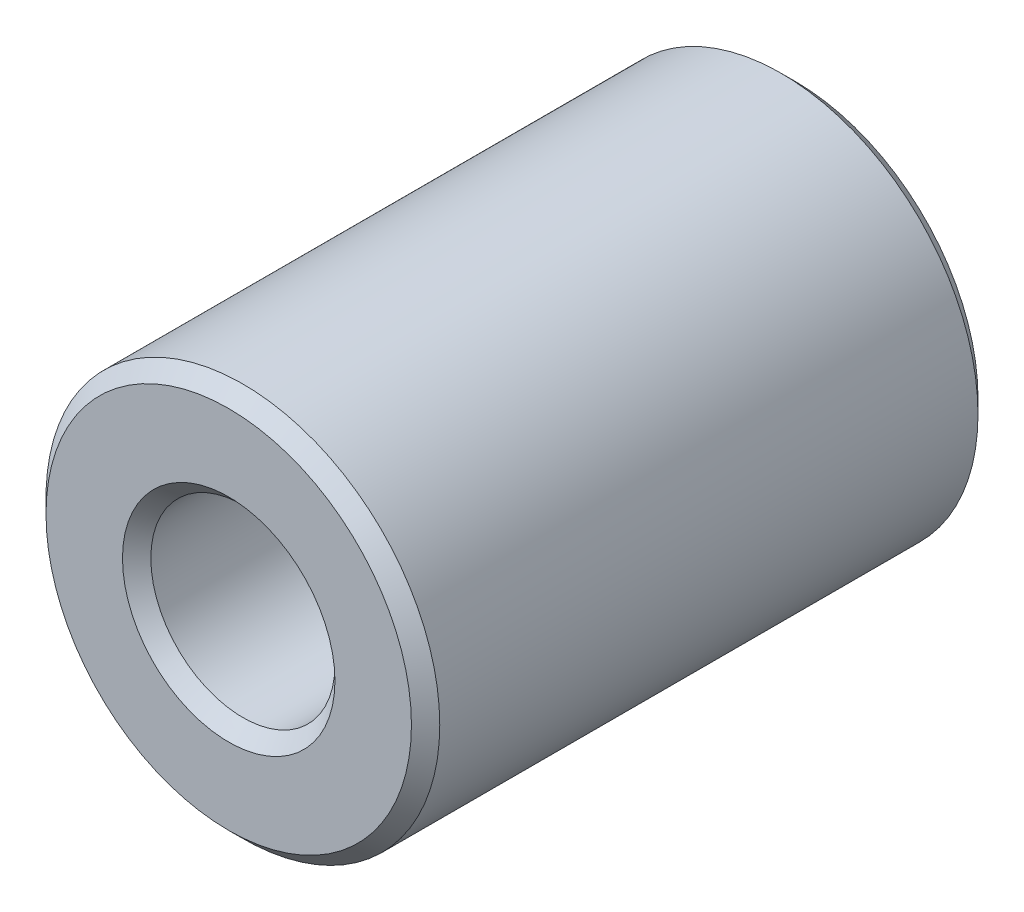
ISO-10303-21;
HEADER;
FILE_DESCRIPTION(('STEP AP214'),'2;1');
FILE_NAME('part.step','',(''),(''),'','','');
FILE_SCHEMA(('AUTOMOTIVE_DESIGN { 1 0 10303 214 1 1 1 1 }'));
ENDSEC;
DATA;
#1=APPLICATION_CONTEXT('core data for automotive mechanical design processes');
#2=APPLICATION_PROTOCOL_DEFINITION('international standard','automotive_design',2000,#1);
#3=PRODUCT_CONTEXT('',#1,'mechanical');
#4=PRODUCT('Part','Part','',(#3));
#5=PRODUCT_RELATED_PRODUCT_CATEGORY('part','',(#4));
#6=PRODUCT_DEFINITION_FORMATION('','',#4);
#7=PRODUCT_DEFINITION_CONTEXT('part definition',#1,'design');
#8=PRODUCT_DEFINITION('design','',#6,#7);
#9=PRODUCT_DEFINITION_SHAPE('','',#8);
#10=(LENGTH_UNIT() NAMED_UNIT(*) SI_UNIT(.MILLI.,.METRE.));
#11=(NAMED_UNIT(*) PLANE_ANGLE_UNIT() SI_UNIT($,.RADIAN.));
#12=(NAMED_UNIT(*) SI_UNIT($,.STERADIAN.) SOLID_ANGLE_UNIT());
#13=UNCERTAINTY_MEASURE_WITH_UNIT(LENGTH_MEASURE(1.E-05),#10,'distance_accuracy_value','');
#14=(GEOMETRIC_REPRESENTATION_CONTEXT(3) GLOBAL_UNCERTAINTY_ASSIGNED_CONTEXT((#13)) GLOBAL_UNIT_ASSIGNED_CONTEXT((#10,
#11,#12)) REPRESENTATION_CONTEXT('',''));
#15=CARTESIAN_POINT('',(0.,0.,0.));
#16=DIRECTION('',(0.,0.,1.));
#17=DIRECTION('',(1.,0.,0.));
#18=AXIS2_PLACEMENT_3D('',#15,#16,#17);
#19=CARTESIAN_POINT('',(0.,0.,20.));
#20=DIRECTION('',(0.,0.,1.));
#21=DIRECTION('',(1.,0.,0.));
#22=AXIS2_PLACEMENT_3D('',#19,#20,#21);
#23=PLANE('',#22);
#24=CARTESIAN_POINT('',(0.,0.,20.));
#25=DIRECTION('',(0.,0.,1.));
#26=DIRECTION('',(1.,0.,0.));
#27=AXIS2_PLACEMENT_3D('',#24,#25,#26);
#28=CIRCLE('',#27,3.75000000000001);
#29=CARTESIAN_POINT('',(3.75000000000001,0.,20.));
#30=VERTEX_POINT('',#29);
#31=EDGE_CURVE('E10',#30,#30,#28,.F.);
#32=ORIENTED_EDGE('',*,*,#31,.T.);
#33=EDGE_LOOP('',(#32));
#34=FACE_BOUND('',#33,.T.);
#35=CARTESIAN_POINT('',(0.,0.,20.));
#36=DIRECTION('',(0.,0.,1.));
#37=DIRECTION('',(1.,0.,0.));
#38=AXIS2_PLACEMENT_3D('',#35,#36,#37);
#39=CIRCLE('',#38,6.45);
#40=CARTESIAN_POINT('',(6.45,0.,20.));
#41=VERTEX_POINT('',#40);
#42=EDGE_CURVE('E49',#41,#41,#39,.T.);
#43=ORIENTED_EDGE('',*,*,#42,.T.);
#44=EDGE_LOOP('',(#43));
#45=FACE_BOUND('',#44,.T.);
#46=ADVANCED_FACE('F41',(#34,#45),#23,.T.);
#47=CARTESIAN_POINT('',(0.,0.,0.));
#48=DIRECTION('',(0.,0.,1.));
#49=DIRECTION('',(1.,0.,0.));
#50=AXIS2_PLACEMENT_3D('',#47,#48,#49);
#51=PLANE('',#50);
#52=CARTESIAN_POINT('',(0.,0.,0.));
#53=DIRECTION('',(0.,0.,1.));
#54=DIRECTION('',(1.,0.,0.));
#55=AXIS2_PLACEMENT_3D('',#52,#53,#54);
#56=CIRCLE('',#55,3.75);
#57=CARTESIAN_POINT('',(3.75,0.,0.));
#58=VERTEX_POINT('',#57);
#59=EDGE_CURVE('E68',#58,#58,#56,.T.);
#60=ORIENTED_EDGE('',*,*,#59,.T.);
#61=EDGE_LOOP('',(#60));
#62=FACE_BOUND('',#61,.T.);
#63=CARTESIAN_POINT('',(0.,0.,0.));
#64=DIRECTION('',(0.,0.,1.));
#65=DIRECTION('',(1.,0.,0.));
#66=AXIS2_PLACEMENT_3D('',#63,#64,#65);
#67=CIRCLE('',#66,6.45);
#68=CARTESIAN_POINT('',(6.45,0.,0.));
#69=VERTEX_POINT('',#68);
#70=EDGE_CURVE('E71',#69,#69,#67,.F.);
#71=ORIENTED_EDGE('',*,*,#70,.T.);
#72=EDGE_LOOP('',(#71));
#73=FACE_BOUND('',#72,.T.);
#74=ADVANCED_FACE('F75',(#62,#73),#51,.F.);
#75=CARTESIAN_POINT('',(0.,0.,20.));
#76=DIRECTION('',(0.,0.,-1.));
#77=DIRECTION('',(-1.,0.,0.));
#78=AXIS2_PLACEMENT_3D('',#75,#76,#77);
#79=CYLINDRICAL_SURFACE('',#78,6.95);
#80=CARTESIAN_POINT('',(0.,0.,0.499999999999997));
#81=DIRECTION('',(0.,0.,1.));
#82=DIRECTION('',(1.,0.,0.));
#83=AXIS2_PLACEMENT_3D('',#80,#81,#82);
#84=CIRCLE('',#83,6.95);
#85=CARTESIAN_POINT('',(6.95,0.,0.499999999999997));
#86=VERTEX_POINT('',#85);
#87=EDGE_CURVE('E53',#86,#86,#84,.T.);
#88=ORIENTED_EDGE('',*,*,#87,.T.);
#89=EDGE_LOOP('',(#88));
#90=FACE_BOUND('',#89,.T.);
#91=CARTESIAN_POINT('',(0.,0.,19.5));
#92=DIRECTION('',(0.,0.,1.));
#93=DIRECTION('',(1.,0.,0.));
#94=AXIS2_PLACEMENT_3D('',#91,#92,#93);
#95=CIRCLE('',#94,6.95);
#96=CARTESIAN_POINT('',(6.95,0.,19.5));
#97=VERTEX_POINT('',#96);
#98=EDGE_CURVE('E57',#97,#97,#95,.F.);
#99=ORIENTED_EDGE('',*,*,#98,.T.);
#100=EDGE_LOOP('',(#99));
#101=FACE_BOUND('',#100,.T.);
#102=ADVANCED_FACE('F85',(#90,#101),#79,.T.);
#103=CARTESIAN_POINT('',(0.,0.,20.));
#104=DIRECTION('',(0.,0.,-1.));
#105=DIRECTION('',(-1.,0.,0.));
#106=AXIS2_PLACEMENT_3D('',#103,#104,#105);
#107=CYLINDRICAL_SURFACE('',#106,3.25);
#108=CARTESIAN_POINT('',(0.,0.,0.499999999999997));
#109=DIRECTION('',(0.,0.,1.));
#110=DIRECTION('',(1.,0.,0.));
#111=AXIS2_PLACEMENT_3D('',#108,#109,#110);
#112=CIRCLE('',#111,3.25);
#113=CARTESIAN_POINT('',(3.25,0.,0.499999999999997));
#114=VERTEX_POINT('',#113);
#115=EDGE_CURVE('E62',#114,#114,#112,.F.);
#116=ORIENTED_EDGE('',*,*,#115,.T.);
#117=EDGE_LOOP('',(#116));
#118=FACE_BOUND('',#117,.T.);
#119=CARTESIAN_POINT('',(0.,0.,19.5));
#120=DIRECTION('',(0.,0.,1.));
#121=DIRECTION('',(1.,0.,0.));
#122=AXIS2_PLACEMENT_3D('',#119,#120,#121);
#123=CIRCLE('',#122,3.25);
#124=CARTESIAN_POINT('',(3.25,0.,19.5));
#125=VERTEX_POINT('',#124);
#126=EDGE_CURVE('E65',#125,#125,#123,.T.);
#127=ORIENTED_EDGE('',*,*,#126,.T.);
#128=EDGE_LOOP('',(#127));
#129=FACE_BOUND('',#128,.T.);
#130=ADVANCED_FACE('F88',(#118,#129),#107,.F.);
#131=CARTESIAN_POINT('',(0.,0.,0.));
#132=DIRECTION('',(0.,0.,-1.));
#133=DIRECTION('',(-1.,0.,0.));
#134=AXIS2_PLACEMENT_3D('',#131,#132,#133);
#135=CONICAL_SURFACE('',#134,3.75,0.785398163397451);
#136=ORIENTED_EDGE('',*,*,#115,.F.);
#137=EDGE_LOOP('',(#136));
#138=FACE_BOUND('',#137,.T.);
#139=ORIENTED_EDGE('',*,*,#59,.F.);
#140=EDGE_LOOP('',(#139));
#141=FACE_BOUND('',#140,.T.);
#142=ADVANCED_FACE('F81',(#138,#141),#135,.F.);
#143=CARTESIAN_POINT('',(0.,0.,0.499999999999997));
#144=DIRECTION('',(0.,0.,1.));
#145=DIRECTION('',(1.,0.,0.));
#146=AXIS2_PLACEMENT_3D('',#143,#144,#145);
#147=CONICAL_SURFACE('',#146,6.95,0.78539816339745);
#148=ORIENTED_EDGE('',*,*,#70,.F.);
#149=EDGE_LOOP('',(#148));
#150=FACE_BOUND('',#149,.T.);
#151=ORIENTED_EDGE('',*,*,#87,.F.);
#152=EDGE_LOOP('',(#151));
#153=FACE_BOUND('',#152,.T.);
#154=ADVANCED_FACE('F77',(#150,#153),#147,.T.);
#155=CARTESIAN_POINT('',(0.,0.,19.5));
#156=DIRECTION('',(0.,0.,1.));
#157=DIRECTION('',(1.,0.,0.));
#158=AXIS2_PLACEMENT_3D('',#155,#156,#157);
#159=CONICAL_SURFACE('',#158,3.25,0.785398163397458);
#160=ORIENTED_EDGE('',*,*,#31,.F.);
#161=EDGE_LOOP('',(#160));
#162=FACE_BOUND('',#161,.T.);
#163=ORIENTED_EDGE('',*,*,#126,.F.);
#164=EDGE_LOOP('',(#163));
#165=FACE_BOUND('',#164,.T.);
#166=ADVANCED_FACE('F80',(#162,#165),#159,.F.);
#167=CARTESIAN_POINT('',(0.,0.,20.));
#168=DIRECTION('',(0.,0.,-1.));
#169=DIRECTION('',(-1.,0.,0.));
#170=AXIS2_PLACEMENT_3D('',#167,#168,#169);
#171=CONICAL_SURFACE('',#170,6.45,0.785398163397447);
#172=ORIENTED_EDGE('',*,*,#98,.F.);
#173=EDGE_LOOP('',(#172));
#174=FACE_BOUND('',#173,.T.);
#175=ORIENTED_EDGE('',*,*,#42,.F.);
#176=EDGE_LOOP('',(#175));
#177=FACE_BOUND('',#176,.T.);
#178=ADVANCED_FACE('F44',(#174,#177),#171,.T.);
#179=CLOSED_SHELL('',(#46,#74,#102,#130,#142,#154,#166,#178));
#180=MANIFOLD_SOLID_BREP('B2',#179);
#181=ADVANCED_BREP_SHAPE_REPRESENTATION('',(#18,#180),#14);
#182=SHAPE_DEFINITION_REPRESENTATION(#9,#181);
ENDSEC;
END-ISO-10303-21;
